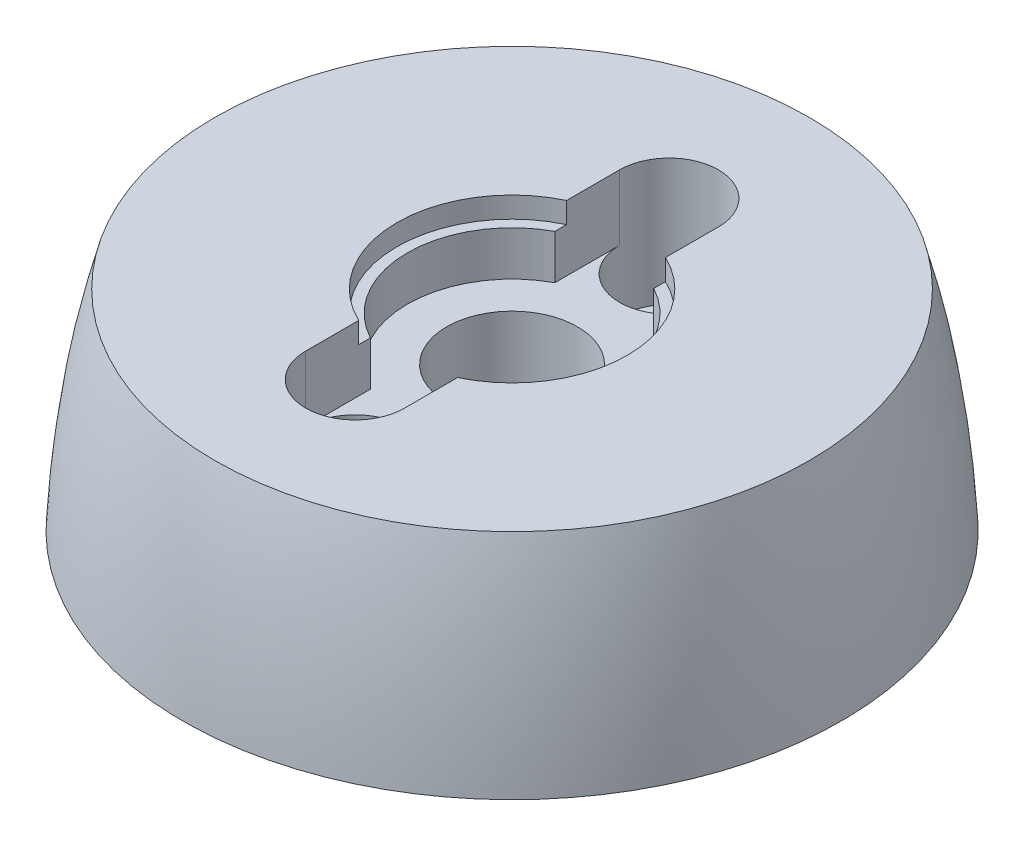
ISO-10303-21;
HEADER;
FILE_DESCRIPTION(('STEP AP214'),'2;1');
FILE_NAME('part.step','',(''),(''),'','','');
FILE_SCHEMA(('AUTOMOTIVE_DESIGN { 1 0 10303 214 1 1 1 1 }'));
ENDSEC;
DATA;
#1=APPLICATION_CONTEXT('core data for automotive mechanical design processes');
#2=APPLICATION_PROTOCOL_DEFINITION('international standard','automotive_design',2000,#1);
#3=PRODUCT_CONTEXT('',#1,'mechanical');
#4=PRODUCT('Part','Part','',(#3));
#5=PRODUCT_RELATED_PRODUCT_CATEGORY('part','',(#4));
#6=PRODUCT_DEFINITION_FORMATION('','',#4);
#7=PRODUCT_DEFINITION_CONTEXT('part definition',#1,'design');
#8=PRODUCT_DEFINITION('design','',#6,#7);
#9=PRODUCT_DEFINITION_SHAPE('','',#8);
#10=(LENGTH_UNIT() NAMED_UNIT(*) SI_UNIT(.MILLI.,.METRE.));
#11=(NAMED_UNIT(*) PLANE_ANGLE_UNIT() SI_UNIT($,.RADIAN.));
#12=(NAMED_UNIT(*) SI_UNIT($,.STERADIAN.) SOLID_ANGLE_UNIT());
#13=UNCERTAINTY_MEASURE_WITH_UNIT(LENGTH_MEASURE(1.E-05),#10,'distance_accuracy_value','');
#14=(GEOMETRIC_REPRESENTATION_CONTEXT(3) GLOBAL_UNCERTAINTY_ASSIGNED_CONTEXT((#13)) GLOBAL_UNIT_ASSIGNED_CONTEXT((#10,
#11,#12)) REPRESENTATION_CONTEXT('',''));
#15=CARTESIAN_POINT('',(0.,0.,0.));
#16=DIRECTION('',(0.,0.,1.));
#17=DIRECTION('',(1.,0.,0.));
#18=AXIS2_PLACEMENT_3D('',#15,#16,#17);
#19=CARTESIAN_POINT('',(0.,8.73125,0.));
#20=DIRECTION('',(0.,1.,0.));
#21=DIRECTION('',(0.,0.,1.));
#22=AXIS2_PLACEMENT_3D('',#19,#20,#21);
#23=CYLINDRICAL_SURFACE('',#22,6.35);
#24=CARTESIAN_POINT('',(0.,11.43,0.));
#25=DIRECTION('',(0.,1.,0.));
#26=DIRECTION('',(0.,0.,1.));
#27=AXIS2_PLACEMENT_3D('',#24,#25,#26);
#28=CIRCLE('',#27,6.35);
#29=CARTESIAN_POINT('',(2.99999999999999,11.43,-5.59665078417441));
#30=VERTEX_POINT('',#29);
#31=CARTESIAN_POINT('',(2.99999999999999,11.43,5.59665078417441));
#32=VERTEX_POINT('',#31);
#33=EDGE_CURVE('E55',#30,#32,#28,.F.);
#34=ORIENTED_EDGE('',*,*,#33,.F.);
#35=DIRECTION('',(0.,1.,0.));
#36=VECTOR('',#35,1.);
#37=CARTESIAN_POINT('',(2.99999999999999,8.73125,-5.59665078417441));
#38=LINE('',#37,#36);
#39=CARTESIAN_POINT('',(2.99999999999999,8.73125,-5.59665078417441));
#40=VERTEX_POINT('',#39);
#41=EDGE_CURVE('E175',#40,#30,#38,.T.);
#42=ORIENTED_EDGE('',*,*,#41,.F.);
#43=CARTESIAN_POINT('',(0.,8.73125,0.));
#44=DIRECTION('',(0.,1.,0.));
#45=DIRECTION('',(0.,0.,1.));
#46=AXIS2_PLACEMENT_3D('',#43,#44,#45);
#47=CIRCLE('',#46,6.35);
#48=CARTESIAN_POINT('',(2.99999999999999,8.73125,5.59665078417441));
#49=VERTEX_POINT('',#48);
#50=EDGE_CURVE('E274',#49,#40,#47,.T.);
#51=ORIENTED_EDGE('',*,*,#50,.F.);
#52=DIRECTION('',(0.,1.,0.));
#53=VECTOR('',#52,1.);
#54=CARTESIAN_POINT('',(2.99999999999999,8.73125,5.59665078417441));
#55=LINE('',#54,#53);
#56=EDGE_CURVE('E179',#49,#32,#55,.T.);
#57=ORIENTED_EDGE('',*,*,#56,.T.);
#58=EDGE_LOOP('',(#34,#42,#51,#57));
#59=FACE_BOUND('',#58,.T.);
#60=ADVANCED_FACE('F38',(#59),#23,.F.);
#61=CARTESIAN_POINT('',(0.,8.73125,0.));
#62=DIRECTION('',(0.,1.,0.));
#63=DIRECTION('',(0.,0.,1.));
#64=AXIS2_PLACEMENT_3D('',#61,#62,#63);
#65=CYLINDRICAL_SURFACE('',#64,6.35);
#66=CARTESIAN_POINT('',(0.,11.43,0.));
#67=DIRECTION('',(0.,1.,0.));
#68=DIRECTION('',(0.,0.,1.));
#69=AXIS2_PLACEMENT_3D('',#66,#67,#68);
#70=CIRCLE('',#69,6.35);
#71=CARTESIAN_POINT('',(-2.99999999999999,11.43,5.59665078417441));
#72=VERTEX_POINT('',#71);
#73=CARTESIAN_POINT('',(-2.99999999999999,11.43,-5.59665078417441));
#74=VERTEX_POINT('',#73);
#75=EDGE_CURVE('E63',#72,#74,#70,.F.);
#76=ORIENTED_EDGE('',*,*,#75,.F.);
#77=DIRECTION('',(0.,1.,0.));
#78=VECTOR('',#77,1.);
#79=CARTESIAN_POINT('',(-2.99999999999999,8.73125,5.59665078417441));
#80=LINE('',#79,#78);
#81=CARTESIAN_POINT('',(-2.99999999999999,8.73125,5.59665078417441));
#82=VERTEX_POINT('',#81);
#83=EDGE_CURVE('E189',#82,#72,#80,.T.);
#84=ORIENTED_EDGE('',*,*,#83,.F.);
#85=CARTESIAN_POINT('',(0.,8.73125,0.));
#86=DIRECTION('',(0.,1.,0.));
#87=DIRECTION('',(0.,0.,1.));
#88=AXIS2_PLACEMENT_3D('',#85,#86,#87);
#89=CIRCLE('',#88,6.35);
#90=CARTESIAN_POINT('',(-2.99999999999999,8.73125,-5.59665078417441));
#91=VERTEX_POINT('',#90);
#92=EDGE_CURVE('E286',#91,#82,#89,.T.);
#93=ORIENTED_EDGE('',*,*,#92,.F.);
#94=DIRECTION('',(0.,1.,0.));
#95=VECTOR('',#94,1.);
#96=CARTESIAN_POINT('',(-2.99999999999999,8.73125,-5.59665078417441));
#97=LINE('',#96,#95);
#98=EDGE_CURVE('E193',#91,#74,#97,.T.);
#99=ORIENTED_EDGE('',*,*,#98,.T.);
#100=EDGE_LOOP('',(#76,#84,#93,#99));
#101=FACE_BOUND('',#100,.T.);
#102=ADVANCED_FACE('F331',(#101),#65,.F.);
#103=CARTESIAN_POINT('',(0.,40.,-9.525));
#104=DIRECTION('',(0.,1.,0.));
#105=DIRECTION('',(0.,0.,1.));
#106=AXIS2_PLACEMENT_3D('',#103,#104,#105);
#107=CYLINDRICAL_SURFACE('',#106,2.99999999999999);
#108=CARTESIAN_POINT('',(0.,5.,-9.525));
#109=DIRECTION('',(0.,1.,0.));
#110=DIRECTION('',(0.,0.,1.));
#111=AXIS2_PLACEMENT_3D('',#108,#109,#110);
#112=CIRCLE('',#111,2.99999999999999);
#113=CARTESIAN_POINT('',(0.,5.,-6.52500000000001));
#114=VERTEX_POINT('',#113);
#115=EDGE_CURVE('E211',#114,#114,#112,.T.);
#116=ORIENTED_EDGE('',*,*,#115,.F.);
#117=EDGE_LOOP('',(#116));
#118=FACE_BOUND('',#117,.T.);
#119=CARTESIAN_POINT('',(0.,8.73125,-9.525));
#120=DIRECTION('',(0.,1.,0.));
#121=DIRECTION('',(0.,0.,1.));
#122=AXIS2_PLACEMENT_3D('',#119,#120,#121);
#123=CIRCLE('',#122,2.99999999999999);
#124=CARTESIAN_POINT('',(2.99999999999999,8.73125,-9.525));
#125=VERTEX_POINT('',#124);
#126=CARTESIAN_POINT('',(-2.99999999999999,8.73125,-9.525));
#127=VERTEX_POINT('',#126);
#128=EDGE_CURVE('E245',#125,#127,#123,.F.);
#129=ORIENTED_EDGE('',*,*,#128,.F.);
#130=DIRECTION('',(0.,1.,0.));
#131=VECTOR('',#130,1.);
#132=CARTESIAN_POINT('',(2.99999999999999,8.73125,-9.525));
#133=LINE('',#132,#131);
#134=CARTESIAN_POINT('',(2.99999999999999,12.7,-9.525));
#135=VERTEX_POINT('',#134);
#136=EDGE_CURVE('E170',#125,#135,#133,.T.);
#137=ORIENTED_EDGE('',*,*,#136,.T.);
#138=CARTESIAN_POINT('',(0.,12.7,-9.525));
#139=DIRECTION('',(0.,-1.,0.));
#140=DIRECTION('',(0.,0.,-1.));
#141=AXIS2_PLACEMENT_3D('',#138,#139,#140);
#142=CIRCLE('',#141,2.99999999999999);
#143=CARTESIAN_POINT('',(-2.99999999999999,12.7,-9.525));
#144=VERTEX_POINT('',#143);
#145=EDGE_CURVE('E203',#135,#144,#142,.F.);
#146=ORIENTED_EDGE('',*,*,#145,.T.);
#147=DIRECTION('',(0.,1.,0.));
#148=VECTOR('',#147,1.);
#149=CARTESIAN_POINT('',(-2.99999999999999,8.73125,-9.525));
#150=LINE('',#149,#148);
#151=EDGE_CURVE('E197',#127,#144,#150,.T.);
#152=ORIENTED_EDGE('',*,*,#151,.F.);
#153=EDGE_LOOP('',(#129,#137,#146,#152));
#154=FACE_BOUND('',#153,.T.);
#155=ADVANCED_FACE('F334',(#118,#154),#107,.F.);
#156=CARTESIAN_POINT('',(20.,0.,0.));
#157=CARTESIAN_POINT('',(19.406701728429,11.2194562344956,0.));
#158=CARTESIAN_POINT('',(16.2416129499108,23.8742901450711,0.));
#159=CARTESIAN_POINT('',(5.47750139595035,31.75,0.));
#160=B_SPLINE_CURVE_WITH_KNOTS('',3,(#156,#157,#158,#159),.UNSPECIFIED.,.F.,.F.,(4,4),
(0.132414505536626,1.),.UNSPECIFIED.);
#161=CARTESIAN_POINT('',(0.,0.,0.));
#162=DIRECTION('',(0.,-1.,0.));
#163=AXIS1_PLACEMENT('',#161,#162);
#164=SURFACE_OF_REVOLUTION('',#160,#163);
#165=CARTESIAN_POINT('',(0.,12.7,0.));
#166=DIRECTION('',(0.,-1.,0.));
#167=DIRECTION('',(0.,0.,-1.));
#168=AXIS2_PLACEMENT_3D('',#165,#166,#167);
#169=CIRCLE('',#168,18.0384413842239);
#170=CARTESIAN_POINT('',(0.,12.7,-18.0384413842239));
#171=VERTEX_POINT('',#170);
#172=EDGE_CURVE('E207',#171,#171,#169,.F.);
#173=ORIENTED_EDGE('',*,*,#172,.F.);
#174=EDGE_LOOP('',(#173));
#175=FACE_BOUND('',#174,.T.);
#176=CARTESIAN_POINT('',(0.,0.,0.));
#177=DIRECTION('',(0.,-1.,0.));
#178=DIRECTION('',(0.,0.,-1.));
#179=AXIS2_PLACEMENT_3D('',#176,#177,#178);
#180=CIRCLE('',#179,20.);
#181=CARTESIAN_POINT('',(0.,0.,-20.));
#182=VERTEX_POINT('',#181);
#183=EDGE_CURVE('E234',#182,#182,#180,.T.);
#184=ORIENTED_EDGE('',*,*,#183,.F.);
#185=EDGE_LOOP('',(#184));
#186=FACE_BOUND('',#185,.T.);
#187=ADVANCED_FACE('F40',(#175,#186),#164,.F.);
#188=CARTESIAN_POINT('',(0.,0.,0.));
#189=DIRECTION('',(0.,-1.,0.));
#190=DIRECTION('',(0.,0.,-1.));
#191=AXIS2_PLACEMENT_3D('',#188,#189,#190);
#192=PLANE('',#191);
#193=CARTESIAN_POINT('',(0.,0.,0.));
#194=DIRECTION('',(0.,1.,0.));
#195=DIRECTION('',(0.,0.,1.));
#196=AXIS2_PLACEMENT_3D('',#193,#194,#195);
#197=CIRCLE('',#196,3.96875);
#198=CARTESIAN_POINT('',(0.,0.,3.96875));
#199=VERTEX_POINT('',#198);
#200=EDGE_CURVE('E313',#199,#199,#197,.T.);
#201=ORIENTED_EDGE('',*,*,#200,.T.);
#202=EDGE_LOOP('',(#201));
#203=FACE_BOUND('',#202,.T.);
#204=CARTESIAN_POINT('',(0.,0.,-9.525));
#205=DIRECTION('',(0.,-1.,0.));
#206=DIRECTION('',(0.,0.,-1.));
#207=AXIS2_PLACEMENT_3D('',#204,#205,#206);
#208=CIRCLE('',#207,1.69999999999999);
#209=CARTESIAN_POINT('',(0.,0.,-11.225));
#210=VERTEX_POINT('',#209);
#211=EDGE_CURVE('E219',#210,#210,#208,.T.);
#212=ORIENTED_EDGE('',*,*,#211,.F.);
#213=EDGE_LOOP('',(#212));
#214=FACE_BOUND('',#213,.T.);
#215=CARTESIAN_POINT('',(0.,0.,9.525));
#216=DIRECTION('',(0.,-1.,0.));
#217=DIRECTION('',(0.,0.,-1.));
#218=AXIS2_PLACEMENT_3D('',#215,#216,#217);
#219=CIRCLE('',#218,1.69999999999999);
#220=CARTESIAN_POINT('',(0.,0.,7.82500000000001));
#221=VERTEX_POINT('',#220);
#222=EDGE_CURVE('E231',#221,#221,#219,.T.);
#223=ORIENTED_EDGE('',*,*,#222,.F.);
#224=EDGE_LOOP('',(#223));
#225=FACE_BOUND('',#224,.T.);
#226=ORIENTED_EDGE('',*,*,#183,.T.);
#227=EDGE_LOOP('',(#226));
#228=FACE_BOUND('',#227,.T.);
#229=ADVANCED_FACE('F391',(#203,#214,#225,#228),#192,.T.);
#230=CARTESIAN_POINT('',(0.,40.,9.525));
#231=DIRECTION('',(0.,1.,0.));
#232=DIRECTION('',(0.,0.,1.));
#233=AXIS2_PLACEMENT_3D('',#230,#231,#232);
#234=CYLINDRICAL_SURFACE('',#233,1.69999999999999);
#235=CARTESIAN_POINT('',(0.,5.,9.525));
#236=DIRECTION('',(0.,1.,0.));
#237=DIRECTION('',(0.,0.,1.));
#238=AXIS2_PLACEMENT_3D('',#235,#236,#237);
#239=CIRCLE('',#238,1.69999999999999);
#240=CARTESIAN_POINT('',(0.,5.,11.225));
#241=VERTEX_POINT('',#240);
#242=EDGE_CURVE('E227',#241,#241,#239,.T.);
#243=ORIENTED_EDGE('',*,*,#242,.T.);
#244=EDGE_LOOP('',(#243));
#245=FACE_BOUND('',#244,.T.);
#246=ORIENTED_EDGE('',*,*,#222,.T.);
#247=EDGE_LOOP('',(#246));
#248=FACE_BOUND('',#247,.T.);
#249=ADVANCED_FACE('F388',(#245,#248),#234,.F.);
#250=CARTESIAN_POINT('',(1.69999999999999,5.,9.525));
#251=DIRECTION('',(0.,-1.,0.));
#252=DIRECTION('',(0.,0.,-1.));
#253=AXIS2_PLACEMENT_3D('',#250,#251,#252);
#254=PLANE('',#253);
#255=ORIENTED_EDGE('',*,*,#242,.F.);
#256=EDGE_LOOP('',(#255));
#257=FACE_BOUND('',#256,.T.);
#258=CARTESIAN_POINT('',(0.,5.,9.525));
#259=DIRECTION('',(0.,1.,0.));
#260=DIRECTION('',(0.,0.,1.));
#261=AXIS2_PLACEMENT_3D('',#258,#259,#260);
#262=CIRCLE('',#261,2.99999999999999);
#263=CARTESIAN_POINT('',(0.,5.,12.525));
#264=VERTEX_POINT('',#263);
#265=EDGE_CURVE('E223',#264,#264,#262,.T.);
#266=ORIENTED_EDGE('',*,*,#265,.T.);
#267=EDGE_LOOP('',(#266));
#268=FACE_BOUND('',#267,.T.);
#269=ADVANCED_FACE('F385',(#257,#268),#254,.F.);
#270=CARTESIAN_POINT('',(0.,40.,9.525));
#271=DIRECTION('',(0.,1.,0.));
#272=DIRECTION('',(0.,0.,1.));
#273=AXIS2_PLACEMENT_3D('',#270,#271,#272);
#274=CYLINDRICAL_SURFACE('',#273,2.99999999999999);
#275=CARTESIAN_POINT('',(0.,12.7,9.525));
#276=DIRECTION('',(0.,-1.,0.));
#277=DIRECTION('',(0.,0.,-1.));
#278=AXIS2_PLACEMENT_3D('',#275,#276,#277);
#279=CIRCLE('',#278,2.99999999999999);
#280=CARTESIAN_POINT('',(-2.99999999999999,12.7,9.525));
#281=VERTEX_POINT('',#280);
#282=CARTESIAN_POINT('',(2.99999999999999,12.7,9.525));
#283=VERTEX_POINT('',#282);
#284=EDGE_CURVE('E204',#281,#283,#279,.F.);
#285=ORIENTED_EDGE('',*,*,#284,.T.);
#286=DIRECTION('',(0.,1.,0.));
#287=VECTOR('',#286,1.);
#288=CARTESIAN_POINT('',(2.99999999999999,8.73125,9.525));
#289=LINE('',#288,#287);
#290=CARTESIAN_POINT('',(2.99999999999999,8.73125,9.525));
#291=VERTEX_POINT('',#290);
#292=EDGE_CURVE('E158',#291,#283,#289,.T.);
#293=ORIENTED_EDGE('',*,*,#292,.F.);
#294=CARTESIAN_POINT('',(0.,8.73125,9.525));
#295=DIRECTION('',(0.,1.,0.));
#296=DIRECTION('',(0.,0.,1.));
#297=AXIS2_PLACEMENT_3D('',#294,#295,#296);
#298=CIRCLE('',#297,2.99999999999999);
#299=CARTESIAN_POINT('',(-2.99999999999999,8.73125,9.525));
#300=VERTEX_POINT('',#299);
#301=EDGE_CURVE('E174',#300,#291,#298,.F.);
#302=ORIENTED_EDGE('',*,*,#301,.F.);
#303=DIRECTION('',(0.,1.,0.));
#304=VECTOR('',#303,1.);
#305=CARTESIAN_POINT('',(-2.99999999999999,8.73125,9.525));
#306=LINE('',#305,#304);
#307=EDGE_CURVE('E185',#300,#281,#306,.T.);
#308=ORIENTED_EDGE('',*,*,#307,.T.);
#309=EDGE_LOOP('',(#285,#293,#302,#308));
#310=FACE_BOUND('',#309,.T.);
#311=ORIENTED_EDGE('',*,*,#265,.F.);
#312=EDGE_LOOP('',(#311));
#313=FACE_BOUND('',#312,.T.);
#314=ADVANCED_FACE('F323',(#310,#313),#274,.F.);
#315=CARTESIAN_POINT('',(0.,40.,-9.525));
#316=DIRECTION('',(0.,1.,0.));
#317=DIRECTION('',(0.,0.,1.));
#318=AXIS2_PLACEMENT_3D('',#315,#316,#317);
#319=CYLINDRICAL_SURFACE('',#318,1.69999999999999);
#320=CARTESIAN_POINT('',(0.,5.,-9.525));
#321=DIRECTION('',(0.,1.,0.));
#322=DIRECTION('',(0.,0.,1.));
#323=AXIS2_PLACEMENT_3D('',#320,#321,#322);
#324=CIRCLE('',#323,1.69999999999999);
#325=CARTESIAN_POINT('',(0.,5.,-7.82500000000001));
#326=VERTEX_POINT('',#325);
#327=EDGE_CURVE('E215',#326,#326,#324,.T.);
#328=ORIENTED_EDGE('',*,*,#327,.T.);
#329=EDGE_LOOP('',(#328));
#330=FACE_BOUND('',#329,.T.);
#331=ORIENTED_EDGE('',*,*,#211,.T.);
#332=EDGE_LOOP('',(#331));
#333=FACE_BOUND('',#332,.T.);
#334=ADVANCED_FACE('F378',(#330,#333),#319,.F.);
#335=CARTESIAN_POINT('',(1.69999999999999,5.,-9.525));
#336=DIRECTION('',(0.,-1.,0.));
#337=DIRECTION('',(0.,0.,-1.));
#338=AXIS2_PLACEMENT_3D('',#335,#336,#337);
#339=PLANE('',#338);
#340=ORIENTED_EDGE('',*,*,#327,.F.);
#341=EDGE_LOOP('',(#340));
#342=FACE_BOUND('',#341,.T.);
#343=ORIENTED_EDGE('',*,*,#115,.T.);
#344=EDGE_LOOP('',(#343));
#345=FACE_BOUND('',#344,.T.);
#346=ADVANCED_FACE('F371',(#342,#345),#339,.F.);
#347=CARTESIAN_POINT('',(-22.730378512902,12.7,-20.));
#348=DIRECTION('',(0.,-1.,0.));
#349=DIRECTION('',(0.,0.,-1.));
#350=AXIS2_PLACEMENT_3D('',#347,#348,#349);
#351=PLANE('',#350);
#352=ORIENTED_EDGE('',*,*,#172,.T.);
#353=EDGE_LOOP('',(#352));
#354=FACE_BOUND('',#353,.T.);
#355=DIRECTION('',(0.,0.,-1.));
#356=VECTOR('',#355,1.);
#357=CARTESIAN_POINT('',(2.99999999999999,12.7,-9.525));
#358=LINE('',#357,#356);
#359=CARTESIAN_POINT('',(2.99999999999999,12.7,-6.30794934982836));
#360=VERTEX_POINT('',#359);
#361=EDGE_CURVE('E150',#360,#135,#358,.T.);
#362=ORIENTED_EDGE('',*,*,#361,.F.);
#363=CARTESIAN_POINT('',(0.,12.7,0.));
#364=DIRECTION('',(0.,1.,0.));
#365=DIRECTION('',(0.,0.,1.));
#366=AXIS2_PLACEMENT_3D('',#363,#364,#365);
#367=CIRCLE('',#366,6.985);
#368=CARTESIAN_POINT('',(2.99999999999999,12.7,6.30794934982836));
#369=VERTEX_POINT('',#368);
#370=EDGE_CURVE('E132',#369,#360,#367,.T.);
#371=ORIENTED_EDGE('',*,*,#370,.F.);
#372=DIRECTION('',(0.,0.,-1.));
#373=VECTOR('',#372,1.);
#374=CARTESIAN_POINT('',(2.99999999999999,12.7,9.525));
#375=LINE('',#374,#373);
#376=EDGE_CURVE('E147',#283,#369,#375,.T.);
#377=ORIENTED_EDGE('',*,*,#376,.F.);
#378=ORIENTED_EDGE('',*,*,#284,.F.);
#379=DIRECTION('',(0.,0.,1.));
#380=VECTOR('',#379,1.);
#381=CARTESIAN_POINT('',(-2.99999999999999,12.7,9.525));
#382=LINE('',#381,#380);
#383=CARTESIAN_POINT('',(-2.99999999999999,12.7,6.30794934982836));
#384=VERTEX_POINT('',#383);
#385=EDGE_CURVE('E160',#384,#281,#382,.T.);
#386=ORIENTED_EDGE('',*,*,#385,.F.);
#387=CARTESIAN_POINT('',(-2.99999999999999,12.7,-6.30794934982836));
#388=VERTEX_POINT('',#387);
#389=EDGE_CURVE('E153',#388,#384,#367,.T.);
#390=ORIENTED_EDGE('',*,*,#389,.F.);
#391=DIRECTION('',(0.,0.,1.));
#392=VECTOR('',#391,1.);
#393=CARTESIAN_POINT('',(-2.99999999999999,12.7,-9.525));
#394=LINE('',#393,#392);
#395=EDGE_CURVE('E166',#144,#388,#394,.T.);
#396=ORIENTED_EDGE('',*,*,#395,.F.);
#397=ORIENTED_EDGE('',*,*,#145,.F.);
#398=EDGE_LOOP('',(#362,#371,#377,#378,#386,#390,#396,#397));
#399=FACE_BOUND('',#398,.T.);
#400=ADVANCED_FACE('F145',(#354,#399),#351,.F.);
#401=CARTESIAN_POINT('',(0.,8.73125,-9.525));
#402=DIRECTION('',(0.,1.,0.));
#403=DIRECTION('',(0.,0.,1.));
#404=AXIS2_PLACEMENT_3D('',#401,#402,#403);
#405=PLANE('',#404);
#406=CARTESIAN_POINT('',(0.,8.73125,0.));
#407=DIRECTION('',(0.,1.,0.));
#408=DIRECTION('',(0.,0.,1.));
#409=AXIS2_PLACEMENT_3D('',#406,#407,#408);
#410=CIRCLE('',#409,3.96875);
#411=CARTESIAN_POINT('',(0.,8.73125,3.96875));
#412=VERTEX_POINT('',#411);
#413=EDGE_CURVE('E309',#412,#412,#410,.T.);
#414=ORIENTED_EDGE('',*,*,#413,.F.);
#415=EDGE_LOOP('',(#414));
#416=FACE_BOUND('',#415,.T.);
#417=ORIENTED_EDGE('',*,*,#301,.T.);
#418=DIRECTION('',(0.,0.,-1.));
#419=VECTOR('',#418,1.);
#420=CARTESIAN_POINT('',(2.99999999999999,8.73125,9.525));
#421=LINE('',#420,#419);
#422=EDGE_CURVE('E278',#291,#49,#421,.T.);
#423=ORIENTED_EDGE('',*,*,#422,.T.);
#424=ORIENTED_EDGE('',*,*,#50,.T.);
#425=DIRECTION('',(0.,0.,-1.));
#426=VECTOR('',#425,1.);
#427=CARTESIAN_POINT('',(2.99999999999999,8.73125,-9.525));
#428=LINE('',#427,#426);
#429=EDGE_CURVE('E200',#40,#125,#428,.T.);
#430=ORIENTED_EDGE('',*,*,#429,.T.);
#431=ORIENTED_EDGE('',*,*,#128,.T.);
#432=DIRECTION('',(0.,0.,1.));
#433=VECTOR('',#432,1.);
#434=CARTESIAN_POINT('',(-2.99999999999999,8.73125,-9.525));
#435=LINE('',#434,#433);
#436=EDGE_CURVE('E164',#127,#91,#435,.T.);
#437=ORIENTED_EDGE('',*,*,#436,.T.);
#438=ORIENTED_EDGE('',*,*,#92,.T.);
#439=DIRECTION('',(0.,0.,1.));
#440=VECTOR('',#439,1.);
#441=CARTESIAN_POINT('',(-2.99999999999999,8.73125,9.525));
#442=LINE('',#441,#440);
#443=EDGE_CURVE('E282',#82,#300,#442,.T.);
#444=ORIENTED_EDGE('',*,*,#443,.T.);
#445=EDGE_LOOP('',(#417,#423,#424,#430,#431,#437,#438,#444));
#446=FACE_BOUND('',#445,.T.);
#447=ADVANCED_FACE('F328',(#416,#446),#405,.T.);
#448=CARTESIAN_POINT('',(2.99999999999999,8.73125,-9.525));
#449=DIRECTION('',(1.,0.,0.));
#450=DIRECTION('',(0.,0.,-1.));
#451=AXIS2_PLACEMENT_3D('',#448,#449,#450);
#452=PLANE('',#451);
#453=DIRECTION('',(0.,0.,1.));
#454=VECTOR('',#453,1.);
#455=CARTESIAN_POINT('',(2.99999999999999,11.43,-9.525));
#456=LINE('',#455,#454);
#457=CARTESIAN_POINT('',(2.99999999999999,11.43,-6.30794934982836));
#458=VERTEX_POINT('',#457);
#459=EDGE_CURVE('E295',#458,#30,#456,.T.);
#460=ORIENTED_EDGE('',*,*,#459,.F.);
#461=DIRECTION('',(0.,1.,0.));
#462=VECTOR('',#461,1.);
#463=CARTESIAN_POINT('',(2.99999999999999,11.43,-6.30794934982836));
#464=LINE('',#463,#462);
#465=EDGE_CURVE('E139',#458,#360,#464,.T.);
#466=ORIENTED_EDGE('',*,*,#465,.T.);
#467=ORIENTED_EDGE('',*,*,#361,.T.);
#468=ORIENTED_EDGE('',*,*,#136,.F.);
#469=ORIENTED_EDGE('',*,*,#429,.F.);
#470=ORIENTED_EDGE('',*,*,#41,.T.);
#471=EDGE_LOOP('',(#460,#466,#467,#468,#469,#470));
#472=FACE_BOUND('',#471,.T.);
#473=ADVANCED_FACE('F338',(#472),#452,.F.);
#474=CARTESIAN_POINT('',(2.99999999999999,8.73125,9.525));
#475=DIRECTION('',(1.,0.,0.));
#476=DIRECTION('',(0.,0.,-1.));
#477=AXIS2_PLACEMENT_3D('',#474,#475,#476);
#478=PLANE('',#477);
#479=ORIENTED_EDGE('',*,*,#376,.T.);
#480=DIRECTION('',(0.,1.,0.));
#481=VECTOR('',#480,1.);
#482=CARTESIAN_POINT('',(2.99999999999999,11.43,6.30794934982836));
#483=LINE('',#482,#481);
#484=CARTESIAN_POINT('',(2.99999999999999,11.43,6.30794934982836));
#485=VERTEX_POINT('',#484);
#486=EDGE_CURVE('E129',#369,#485,#483,.F.);
#487=ORIENTED_EDGE('',*,*,#486,.T.);
#488=DIRECTION('',(0.,0.,1.));
#489=VECTOR('',#488,1.);
#490=CARTESIAN_POINT('',(2.99999999999999,11.43,9.525));
#491=LINE('',#490,#489);
#492=EDGE_CURVE('E300',#32,#485,#491,.T.);
#493=ORIENTED_EDGE('',*,*,#492,.F.);
#494=ORIENTED_EDGE('',*,*,#56,.F.);
#495=ORIENTED_EDGE('',*,*,#422,.F.);
#496=ORIENTED_EDGE('',*,*,#292,.T.);
#497=EDGE_LOOP('',(#479,#487,#493,#494,#495,#496));
#498=FACE_BOUND('',#497,.T.);
#499=ADVANCED_FACE('F155',(#498),#478,.F.);
#500=CARTESIAN_POINT('',(-2.99999999999999,8.73125,9.525));
#501=DIRECTION('',(-1.,0.,0.));
#502=DIRECTION('',(0.,0.,1.));
#503=AXIS2_PLACEMENT_3D('',#500,#501,#502);
#504=PLANE('',#503);
#505=DIRECTION('',(0.,0.,-1.));
#506=VECTOR('',#505,1.);
#507=CARTESIAN_POINT('',(-2.99999999999999,11.43,9.525));
#508=LINE('',#507,#506);
#509=CARTESIAN_POINT('',(-2.99999999999999,11.43,6.30794934982836));
#510=VERTEX_POINT('',#509);
#511=EDGE_CURVE('E303',#510,#72,#508,.T.);
#512=ORIENTED_EDGE('',*,*,#511,.F.);
#513=DIRECTION('',(0.,1.,0.));
#514=VECTOR('',#513,1.);
#515=CARTESIAN_POINT('',(-2.99999999999999,11.43,6.30794934982836));
#516=LINE('',#515,#514);
#517=EDGE_CURVE('E140',#510,#384,#516,.T.);
#518=ORIENTED_EDGE('',*,*,#517,.T.);
#519=ORIENTED_EDGE('',*,*,#385,.T.);
#520=ORIENTED_EDGE('',*,*,#307,.F.);
#521=ORIENTED_EDGE('',*,*,#443,.F.);
#522=ORIENTED_EDGE('',*,*,#83,.T.);
#523=EDGE_LOOP('',(#512,#518,#519,#520,#521,#522));
#524=FACE_BOUND('',#523,.T.);
#525=ADVANCED_FACE('F321',(#524),#504,.F.);
#526=CARTESIAN_POINT('',(-2.99999999999999,8.73125,-9.525));
#527=DIRECTION('',(-1.,0.,0.));
#528=DIRECTION('',(0.,0.,1.));
#529=AXIS2_PLACEMENT_3D('',#526,#527,#528);
#530=PLANE('',#529);
#531=ORIENTED_EDGE('',*,*,#395,.T.);
#532=DIRECTION('',(0.,1.,0.));
#533=VECTOR('',#532,1.);
#534=CARTESIAN_POINT('',(-2.99999999999999,11.43,-6.30794934982836));
#535=LINE('',#534,#533);
#536=CARTESIAN_POINT('',(-2.99999999999999,11.43,-6.30794934982836));
#537=VERTEX_POINT('',#536);
#538=EDGE_CURVE('E11',#388,#537,#535,.F.);
#539=ORIENTED_EDGE('',*,*,#538,.T.);
#540=DIRECTION('',(0.,0.,-1.));
#541=VECTOR('',#540,1.);
#542=CARTESIAN_POINT('',(-2.99999999999999,11.43,-9.525));
#543=LINE('',#542,#541);
#544=EDGE_CURVE('E48',#74,#537,#543,.T.);
#545=ORIENTED_EDGE('',*,*,#544,.F.);
#546=ORIENTED_EDGE('',*,*,#98,.F.);
#547=ORIENTED_EDGE('',*,*,#436,.F.);
#548=ORIENTED_EDGE('',*,*,#151,.T.);
#549=EDGE_LOOP('',(#531,#539,#545,#546,#547,#548));
#550=FACE_BOUND('',#549,.T.);
#551=ADVANCED_FACE('F263',(#550),#530,.F.);
#552=CARTESIAN_POINT('',(0.,11.43,0.));
#553=DIRECTION('',(0.,1.,0.));
#554=DIRECTION('',(0.,0.,1.));
#555=AXIS2_PLACEMENT_3D('',#552,#553,#554);
#556=PLANE('',#555);
#557=ORIENTED_EDGE('',*,*,#511,.T.);
#558=ORIENTED_EDGE('',*,*,#75,.T.);
#559=ORIENTED_EDGE('',*,*,#544,.T.);
#560=CARTESIAN_POINT('',(0.,11.43,0.));
#561=DIRECTION('',(0.,1.,0.));
#562=DIRECTION('',(0.,0.,1.));
#563=AXIS2_PLACEMENT_3D('',#560,#561,#562);
#564=CIRCLE('',#563,6.985);
#565=EDGE_CURVE('E152',#537,#510,#564,.T.);
#566=ORIENTED_EDGE('',*,*,#565,.T.);
#567=EDGE_LOOP('',(#557,#558,#559,#566));
#568=FACE_BOUND('',#567,.T.);
#569=ADVANCED_FACE('F253',(#568),#556,.T.);
#570=CARTESIAN_POINT('',(0.,11.43,0.));
#571=DIRECTION('',(0.,1.,0.));
#572=DIRECTION('',(0.,0.,1.));
#573=AXIS2_PLACEMENT_3D('',#570,#571,#572);
#574=CYLINDRICAL_SURFACE('',#573,6.985);
#575=ORIENTED_EDGE('',*,*,#565,.F.);
#576=ORIENTED_EDGE('',*,*,#538,.F.);
#577=ORIENTED_EDGE('',*,*,#389,.T.);
#578=ORIENTED_EDGE('',*,*,#517,.F.);
#579=EDGE_LOOP('',(#575,#576,#577,#578));
#580=FACE_BOUND('',#579,.T.);
#581=ADVANCED_FACE('F257',(#580),#574,.F.);
#582=EDGE_CURVE('E135',#485,#458,#564,.T.);
#583=ORIENTED_EDGE('',*,*,#582,.F.);
#584=ORIENTED_EDGE('',*,*,#486,.F.);
#585=ORIENTED_EDGE('',*,*,#370,.T.);
#586=ORIENTED_EDGE('',*,*,#465,.F.);
#587=EDGE_LOOP('',(#583,#584,#585,#586));
#588=FACE_BOUND('',#587,.T.);
#589=ADVANCED_FACE('F131',(#588),#574,.F.);
#590=ORIENTED_EDGE('',*,*,#459,.T.);
#591=ORIENTED_EDGE('',*,*,#33,.T.);
#592=ORIENTED_EDGE('',*,*,#492,.T.);
#593=ORIENTED_EDGE('',*,*,#582,.T.);
#594=EDGE_LOOP('',(#590,#591,#592,#593));
#595=FACE_BOUND('',#594,.T.);
#596=ADVANCED_FACE('F341',(#595),#556,.T.);
#597=CARTESIAN_POINT('',(0.,0.,0.));
#598=DIRECTION('',(0.,1.,0.));
#599=DIRECTION('',(0.,0.,1.));
#600=AXIS2_PLACEMENT_3D('',#597,#598,#599);
#601=CYLINDRICAL_SURFACE('',#600,3.96875);
#602=ORIENTED_EDGE('',*,*,#200,.F.);
#603=EDGE_LOOP('',(#602));
#604=FACE_BOUND('',#603,.T.);
#605=ORIENTED_EDGE('',*,*,#413,.T.);
#606=EDGE_LOOP('',(#605));
#607=FACE_BOUND('',#606,.T.);
#608=ADVANCED_FACE('F343',(#604,#607),#601,.F.);
#609=CLOSED_SHELL('',(#60,#102,#155,#187,#229,#249,#269,#314,#334,#346,#400,#447,#473,#499,#525,
#551,#569,#581,#589,#596,#608));
#610=MANIFOLD_SOLID_BREP('B2',#609);
#611=ADVANCED_BREP_SHAPE_REPRESENTATION('',(#18,#610),#14);
#612=SHAPE_DEFINITION_REPRESENTATION(#9,#611);
ENDSEC;
END-ISO-10303-21;
